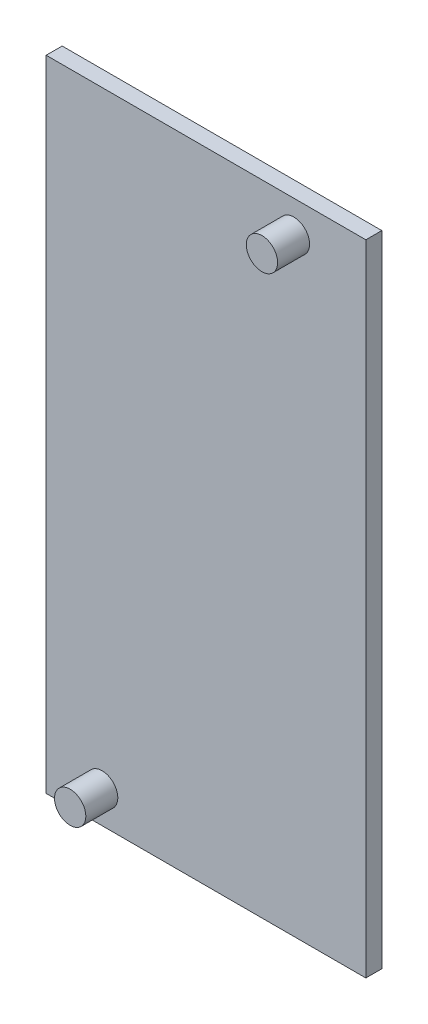
ISO-10303-21;
HEADER;
FILE_DESCRIPTION(('STEP AP214'),'2;1');
FILE_NAME('part.step','',(''),(''),'','','');
FILE_SCHEMA(('AUTOMOTIVE_DESIGN { 1 0 10303 214 1 1 1 1 }'));
ENDSEC;
DATA;
#1=APPLICATION_CONTEXT('core data for automotive mechanical design processes');
#2=APPLICATION_PROTOCOL_DEFINITION('international standard','automotive_design',2000,#1);
#3=PRODUCT_CONTEXT('',#1,'mechanical');
#4=PRODUCT('Part','Part','',(#3));
#5=PRODUCT_RELATED_PRODUCT_CATEGORY('part','',(#4));
#6=PRODUCT_DEFINITION_FORMATION('','',#4);
#7=PRODUCT_DEFINITION_CONTEXT('part definition',#1,'design');
#8=PRODUCT_DEFINITION('design','',#6,#7);
#9=PRODUCT_DEFINITION_SHAPE('','',#8);
#10=(LENGTH_UNIT() NAMED_UNIT(*) SI_UNIT(.MILLI.,.METRE.));
#11=(NAMED_UNIT(*) PLANE_ANGLE_UNIT() SI_UNIT($,.RADIAN.));
#12=(NAMED_UNIT(*) SI_UNIT($,.STERADIAN.) SOLID_ANGLE_UNIT());
#13=UNCERTAINTY_MEASURE_WITH_UNIT(LENGTH_MEASURE(1.E-05),#10,'distance_accuracy_value','');
#14=(GEOMETRIC_REPRESENTATION_CONTEXT(3) GLOBAL_UNCERTAINTY_ASSIGNED_CONTEXT((#13)) GLOBAL_UNIT_ASSIGNED_CONTEXT((#10,
#11,#12)) REPRESENTATION_CONTEXT('',''));
#15=CARTESIAN_POINT('',(0.,0.,0.));
#16=DIRECTION('',(0.,0.,1.));
#17=DIRECTION('',(1.,0.,0.));
#18=AXIS2_PLACEMENT_3D('',#15,#16,#17);
#19=CARTESIAN_POINT('',(0.,0.,5.));
#20=DIRECTION('',(1.,0.,0.));
#21=DIRECTION('',(0.,1.,0.));
#22=AXIS2_PLACEMENT_3D('',#19,#20,#21);
#23=PLANE('',#22);
#24=DIRECTION('',(0.,-1.,0.));
#25=VECTOR('',#24,1.);
#26=CARTESIAN_POINT('',(0.,0.,0.));
#27=LINE('',#26,#25);
#28=CARTESIAN_POINT('',(0.,200.,0.));
#29=VERTEX_POINT('',#28);
#30=CARTESIAN_POINT('',(0.,0.,0.));
#31=VERTEX_POINT('',#30);
#32=EDGE_CURVE('E99',#29,#31,#27,.T.);
#33=ORIENTED_EDGE('',*,*,#32,.T.);
#34=DIRECTION('',(0.,0.,-1.));
#35=VECTOR('',#34,1.);
#36=CARTESIAN_POINT('',(0.,0.,5.));
#37=LINE('',#36,#35);
#38=CARTESIAN_POINT('',(0.,0.,5.));
#39=VERTEX_POINT('',#38);
#40=EDGE_CURVE('E90',#39,#31,#37,.T.);
#41=ORIENTED_EDGE('',*,*,#40,.F.);
#42=DIRECTION('',(0.,-1.,0.));
#43=VECTOR('',#42,1.);
#44=CARTESIAN_POINT('',(0.,0.,5.));
#45=LINE('',#44,#43);
#46=CARTESIAN_POINT('',(0.,200.,5.));
#47=VERTEX_POINT('',#46);
#48=EDGE_CURVE('E84',#47,#39,#45,.T.);
#49=ORIENTED_EDGE('',*,*,#48,.F.);
#50=DIRECTION('',(0.,0.,-1.));
#51=VECTOR('',#50,1.);
#52=CARTESIAN_POINT('',(0.,200.,5.));
#53=LINE('',#52,#51);
#54=EDGE_CURVE('E95',#47,#29,#53,.T.);
#55=ORIENTED_EDGE('',*,*,#54,.T.);
#56=EDGE_LOOP('',(#33,#41,#49,#55));
#57=FACE_BOUND('',#56,.T.);
#58=ADVANCED_FACE('F32',(#57),#23,.F.);
#59=CARTESIAN_POINT('',(0.,0.,5.));
#60=DIRECTION('',(0.,1.,0.));
#61=DIRECTION('',(0.,0.,1.));
#62=AXIS2_PLACEMENT_3D('',#59,#60,#61);
#63=PLANE('',#62);
#64=DIRECTION('',(1.,0.,0.));
#65=VECTOR('',#64,1.);
#66=CARTESIAN_POINT('',(0.,0.,0.));
#67=LINE('',#66,#65);
#68=CARTESIAN_POINT('',(100.,0.,0.));
#69=VERTEX_POINT('',#68);
#70=EDGE_CURVE('E89',#31,#69,#67,.T.);
#71=ORIENTED_EDGE('',*,*,#70,.T.);
#72=DIRECTION('',(0.,0.,-1.));
#73=VECTOR('',#72,1.);
#74=CARTESIAN_POINT('',(100.,0.,5.));
#75=LINE('',#74,#73);
#76=CARTESIAN_POINT('',(100.,0.,5.));
#77=VERTEX_POINT('',#76);
#78=EDGE_CURVE('E87',#77,#69,#75,.T.);
#79=ORIENTED_EDGE('',*,*,#78,.F.);
#80=DIRECTION('',(1.,0.,0.));
#81=VECTOR('',#80,1.);
#82=CARTESIAN_POINT('',(0.,0.,5.));
#83=LINE('',#82,#81);
#84=EDGE_CURVE('E79',#39,#77,#83,.T.);
#85=ORIENTED_EDGE('',*,*,#84,.F.);
#86=ORIENTED_EDGE('',*,*,#40,.T.);
#87=EDGE_LOOP('',(#71,#79,#85,#86));
#88=FACE_BOUND('',#87,.T.);
#89=ADVANCED_FACE('F88',(#88),#63,.F.);
#90=CARTESIAN_POINT('',(100.,0.,5.));
#91=DIRECTION('',(-1.,0.,0.));
#92=DIRECTION('',(0.,-1.,0.));
#93=AXIS2_PLACEMENT_3D('',#90,#91,#92);
#94=PLANE('',#93);
#95=DIRECTION('',(0.,1.,0.));
#96=VECTOR('',#95,1.);
#97=CARTESIAN_POINT('',(100.,0.,0.));
#98=LINE('',#97,#96);
#99=CARTESIAN_POINT('',(100.,200.,0.));
#100=VERTEX_POINT('',#99);
#101=EDGE_CURVE('E65',#69,#100,#98,.T.);
#102=ORIENTED_EDGE('',*,*,#101,.T.);
#103=DIRECTION('',(0.,0.,-1.));
#104=VECTOR('',#103,1.);
#105=CARTESIAN_POINT('',(100.,200.,5.));
#106=LINE('',#105,#104);
#107=CARTESIAN_POINT('',(100.,200.,5.));
#108=VERTEX_POINT('',#107);
#109=EDGE_CURVE('E91',#108,#100,#106,.T.);
#110=ORIENTED_EDGE('',*,*,#109,.F.);
#111=DIRECTION('',(0.,1.,0.));
#112=VECTOR('',#111,1.);
#113=CARTESIAN_POINT('',(100.,0.,5.));
#114=LINE('',#113,#112);
#115=EDGE_CURVE('E82',#77,#108,#114,.T.);
#116=ORIENTED_EDGE('',*,*,#115,.F.);
#117=ORIENTED_EDGE('',*,*,#78,.T.);
#118=EDGE_LOOP('',(#102,#110,#116,#117));
#119=FACE_BOUND('',#118,.T.);
#120=ADVANCED_FACE('F93',(#119),#94,.F.);
#121=CARTESIAN_POINT('',(0.,200.,5.));
#122=DIRECTION('',(0.,-1.,0.));
#123=DIRECTION('',(0.,0.,-1.));
#124=AXIS2_PLACEMENT_3D('',#121,#122,#123);
#125=PLANE('',#124);
#126=DIRECTION('',(-1.,0.,0.));
#127=VECTOR('',#126,1.);
#128=CARTESIAN_POINT('',(0.,200.,0.));
#129=LINE('',#128,#127);
#130=EDGE_CURVE('E71',#100,#29,#129,.T.);
#131=ORIENTED_EDGE('',*,*,#130,.T.);
#132=ORIENTED_EDGE('',*,*,#54,.F.);
#133=DIRECTION('',(-1.,0.,0.));
#134=VECTOR('',#133,1.);
#135=CARTESIAN_POINT('',(0.,200.,5.));
#136=LINE('',#135,#134);
#137=EDGE_CURVE('E48',#108,#47,#136,.T.);
#138=ORIENTED_EDGE('',*,*,#137,.F.);
#139=ORIENTED_EDGE('',*,*,#109,.T.);
#140=EDGE_LOOP('',(#131,#132,#138,#139));
#141=FACE_BOUND('',#140,.T.);
#142=ADVANCED_FACE('F115',(#141),#125,.F.);
#143=CARTESIAN_POINT('',(0.,0.,5.));
#144=DIRECTION('',(0.,0.,-1.));
#145=DIRECTION('',(-1.,0.,0.));
#146=AXIS2_PLACEMENT_3D('',#143,#144,#145);
#147=PLANE('',#146);
#148=CARTESIAN_POINT('',(77.5,190.,5.));
#149=DIRECTION('',(0.,0.,-1.));
#150=DIRECTION('',(-1.,0.,0.));
#151=AXIS2_PLACEMENT_3D('',#148,#149,#150);
#152=CIRCLE('',#151,4.89999999999998);
#153=CARTESIAN_POINT('',(72.6,190.,5.));
#154=VERTEX_POINT('',#153);
#155=EDGE_CURVE('E11',#154,#154,#152,.F.);
#156=ORIENTED_EDGE('',*,*,#155,.F.);
#157=EDGE_LOOP('',(#156));
#158=FACE_BOUND('',#157,.T.);
#159=CARTESIAN_POINT('',(17.5,10.,5.));
#160=DIRECTION('',(0.,0.,-1.));
#161=DIRECTION('',(-1.,0.,0.));
#162=AXIS2_PLACEMENT_3D('',#159,#160,#161);
#163=CIRCLE('',#162,4.9);
#164=CARTESIAN_POINT('',(12.6,10.,5.));
#165=VERTEX_POINT('',#164);
#166=EDGE_CURVE('E40',#165,#165,#163,.F.);
#167=ORIENTED_EDGE('',*,*,#166,.F.);
#168=EDGE_LOOP('',(#167));
#169=FACE_BOUND('',#168,.T.);
#170=ORIENTED_EDGE('',*,*,#48,.T.);
#171=ORIENTED_EDGE('',*,*,#84,.T.);
#172=ORIENTED_EDGE('',*,*,#115,.T.);
#173=ORIENTED_EDGE('',*,*,#137,.T.);
#174=EDGE_LOOP('',(#170,#171,#172,#173));
#175=FACE_BOUND('',#174,.T.);
#176=ADVANCED_FACE('F80',(#158,#169,#175),#147,.F.);
#177=CARTESIAN_POINT('',(0.,0.,0.));
#178=DIRECTION('',(0.,0.,-1.));
#179=DIRECTION('',(-1.,0.,0.));
#180=AXIS2_PLACEMENT_3D('',#177,#178,#179);
#181=PLANE('',#180);
#182=ORIENTED_EDGE('',*,*,#32,.F.);
#183=ORIENTED_EDGE('',*,*,#130,.F.);
#184=ORIENTED_EDGE('',*,*,#101,.F.);
#185=ORIENTED_EDGE('',*,*,#70,.F.);
#186=EDGE_LOOP('',(#182,#183,#184,#185));
#187=FACE_BOUND('',#186,.T.);
#188=ADVANCED_FACE('F114',(#187),#181,.T.);
#189=CARTESIAN_POINT('',(17.5,10.,15.));
#190=DIRECTION('',(0.,0.,-1.));
#191=DIRECTION('',(-1.,0.,0.));
#192=AXIS2_PLACEMENT_3D('',#189,#190,#191);
#193=CYLINDRICAL_SURFACE('',#192,4.9);
#194=CARTESIAN_POINT('',(17.5,10.,15.));
#195=DIRECTION('',(0.,0.,1.));
#196=DIRECTION('',(1.,0.,0.));
#197=AXIS2_PLACEMENT_3D('',#194,#195,#196);
#198=CIRCLE('',#197,4.9);
#199=CARTESIAN_POINT('',(22.4,10.,15.));
#200=VERTEX_POINT('',#199);
#201=EDGE_CURVE('E102',#200,#200,#198,.T.);
#202=ORIENTED_EDGE('',*,*,#201,.F.);
#203=EDGE_LOOP('',(#202));
#204=FACE_BOUND('',#203,.T.);
#205=ORIENTED_EDGE('',*,*,#166,.T.);
#206=EDGE_LOOP('',(#205));
#207=FACE_BOUND('',#206,.T.);
#208=ADVANCED_FACE('F111',(#204,#207),#193,.T.);
#209=CARTESIAN_POINT('',(17.5,10.,15.));
#210=DIRECTION('',(0.,0.,1.));
#211=DIRECTION('',(1.,0.,0.));
#212=AXIS2_PLACEMENT_3D('',#209,#210,#211);
#213=PLANE('',#212);
#214=ORIENTED_EDGE('',*,*,#201,.T.);
#215=EDGE_LOOP('',(#214));
#216=FACE_BOUND('',#215,.T.);
#217=ADVANCED_FACE('F145',(#216),#213,.T.);
#218=CARTESIAN_POINT('',(77.5,190.,15.));
#219=DIRECTION('',(0.,0.,-1.));
#220=DIRECTION('',(-1.,0.,0.));
#221=AXIS2_PLACEMENT_3D('',#218,#219,#220);
#222=CYLINDRICAL_SURFACE('',#221,4.89999999999998);
#223=CARTESIAN_POINT('',(77.5,190.,15.));
#224=DIRECTION('',(0.,0.,1.));
#225=DIRECTION('',(1.,0.,0.));
#226=AXIS2_PLACEMENT_3D('',#223,#224,#225);
#227=CIRCLE('',#226,4.89999999999998);
#228=CARTESIAN_POINT('',(82.3999999999999,190.,15.));
#229=VERTEX_POINT('',#228);
#230=EDGE_CURVE('E136',#229,#229,#227,.T.);
#231=ORIENTED_EDGE('',*,*,#230,.F.);
#232=EDGE_LOOP('',(#231));
#233=FACE_BOUND('',#232,.T.);
#234=ORIENTED_EDGE('',*,*,#155,.T.);
#235=EDGE_LOOP('',(#234));
#236=FACE_BOUND('',#235,.T.);
#237=ADVANCED_FACE('F142',(#233,#236),#222,.T.);
#238=CARTESIAN_POINT('',(77.5,190.,15.));
#239=DIRECTION('',(0.,0.,1.));
#240=DIRECTION('',(1.,0.,0.));
#241=AXIS2_PLACEMENT_3D('',#238,#239,#240);
#242=PLANE('',#241);
#243=ORIENTED_EDGE('',*,*,#230,.T.);
#244=EDGE_LOOP('',(#243));
#245=FACE_BOUND('',#244,.T.);
#246=ADVANCED_FACE('F140',(#245),#242,.T.);
#247=CLOSED_SHELL('',(#58,#89,#120,#142,#176,#188,#208,#217,#237,#246));
#248=MANIFOLD_SOLID_BREP('B2',#247);
#249=ADVANCED_BREP_SHAPE_REPRESENTATION('',(#18,#248),#14);
#250=SHAPE_DEFINITION_REPRESENTATION(#9,#249);
ENDSEC;
END-ISO-10303-21;
